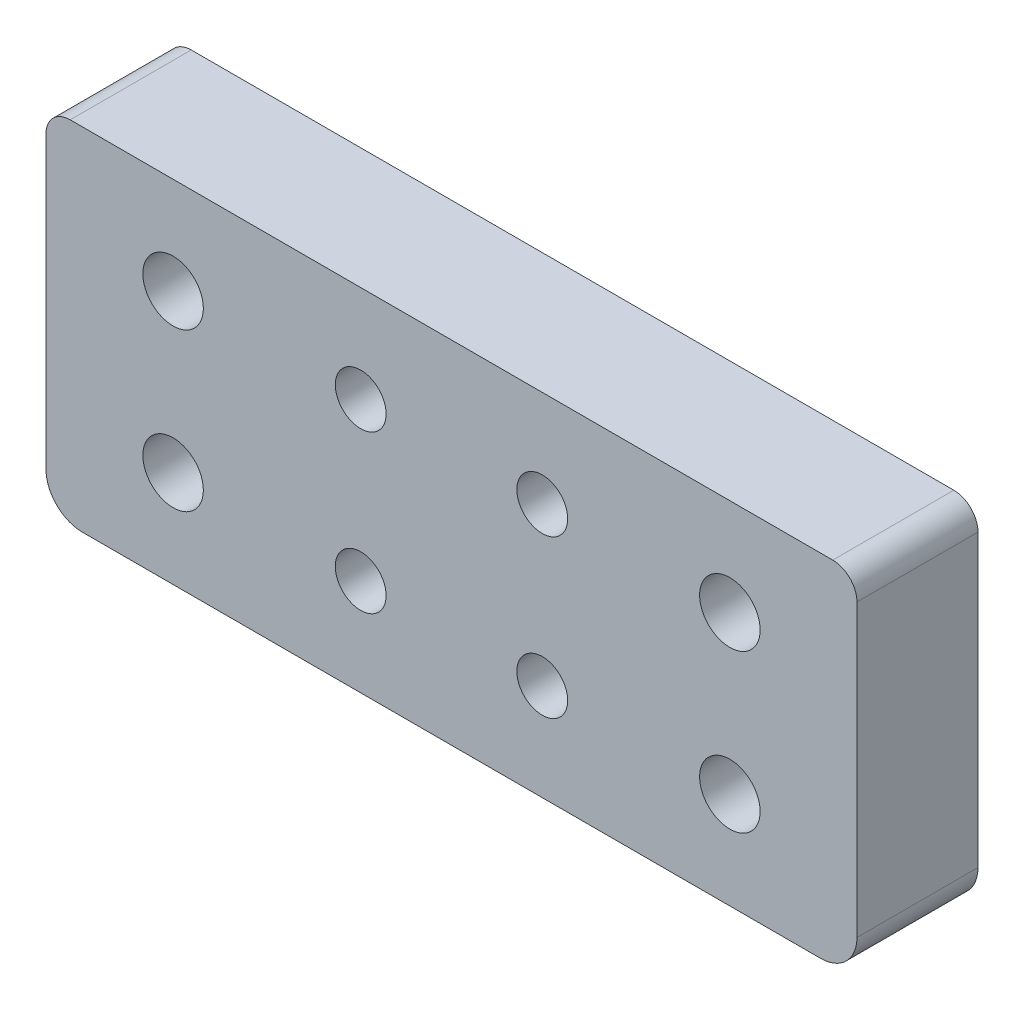
ISO-10303-21;
HEADER;
FILE_DESCRIPTION(('STEP AP214'),'2;1');
FILE_NAME('part.step','',(''),(''),'','','');
FILE_SCHEMA(('AUTOMOTIVE_DESIGN { 1 0 10303 214 1 1 1 1 }'));
ENDSEC;
DATA;
#1=APPLICATION_CONTEXT('core data for automotive mechanical design processes');
#2=APPLICATION_PROTOCOL_DEFINITION('international standard','automotive_design',2000,#1);
#3=PRODUCT_CONTEXT('',#1,'mechanical');
#4=PRODUCT('Part','Part','',(#3));
#5=PRODUCT_RELATED_PRODUCT_CATEGORY('part','',(#4));
#6=PRODUCT_DEFINITION_FORMATION('','',#4);
#7=PRODUCT_DEFINITION_CONTEXT('part definition',#1,'design');
#8=PRODUCT_DEFINITION('design','',#6,#7);
#9=PRODUCT_DEFINITION_SHAPE('','',#8);
#10=(LENGTH_UNIT() NAMED_UNIT(*) SI_UNIT(.MILLI.,.METRE.));
#11=(NAMED_UNIT(*) PLANE_ANGLE_UNIT() SI_UNIT($,.RADIAN.));
#12=(NAMED_UNIT(*) SI_UNIT($,.STERADIAN.) SOLID_ANGLE_UNIT());
#13=UNCERTAINTY_MEASURE_WITH_UNIT(LENGTH_MEASURE(1.E-05),#10,'distance_accuracy_value','');
#14=(GEOMETRIC_REPRESENTATION_CONTEXT(3) GLOBAL_UNCERTAINTY_ASSIGNED_CONTEXT((#13)) GLOBAL_UNIT_ASSIGNED_CONTEXT((#10,
#11,#12)) REPRESENTATION_CONTEXT('',''));
#15=CARTESIAN_POINT('',(0.,0.,0.));
#16=DIRECTION('',(0.,0.,1.));
#17=DIRECTION('',(1.,0.,0.));
#18=AXIS2_PLACEMENT_3D('',#15,#16,#17);
#19=CARTESIAN_POINT('',(0.,0.,10.));
#20=DIRECTION('',(0.,0.,-1.));
#21=DIRECTION('',(-1.,0.,0.));
#22=AXIS2_PLACEMENT_3D('',#19,#20,#21);
#23=PLANE('',#22);
#24=CARTESIAN_POINT('',(-23.,-13.,10.));
#25=DIRECTION('',(0.,0.,1.));
#26=DIRECTION('',(1.,0.,0.));
#27=AXIS2_PLACEMENT_3D('',#24,#25,#26);
#28=CIRCLE('',#27,2.5);
#29=CARTESIAN_POINT('',(-20.5,-13.,10.));
#30=VERTEX_POINT('',#29);
#31=EDGE_CURVE('E297',#30,#30,#28,.T.);
#32=ORIENTED_EDGE('',*,*,#31,.F.);
#33=EDGE_LOOP('',(#32));
#34=FACE_BOUND('',#33,.T.);
#35=CARTESIAN_POINT('',(-7.5,-13.,10.));
#36=DIRECTION('',(0.,0.,1.));
#37=DIRECTION('',(1.,0.,0.));
#38=AXIS2_PLACEMENT_3D('',#35,#36,#37);
#39=CIRCLE('',#38,2.1);
#40=CARTESIAN_POINT('',(-5.4,-13.,10.));
#41=VERTEX_POINT('',#40);
#42=EDGE_CURVE('E152',#41,#41,#39,.T.);
#43=ORIENTED_EDGE('',*,*,#42,.F.);
#44=EDGE_LOOP('',(#43));
#45=FACE_BOUND('',#44,.T.);
#46=DIRECTION('',(-1.,0.,0.));
#47=VECTOR('',#46,1.);
#48=CARTESIAN_POINT('',(-33.5,-21.,10.));
#49=LINE('',#48,#47);
#50=CARTESIAN_POINT('',(30.5,-21.,10.));
#51=VERTEX_POINT('',#50);
#52=CARTESIAN_POINT('',(-30.5,-21.,10.));
#53=VERTEX_POINT('',#52);
#54=EDGE_CURVE('E172',#51,#53,#49,.T.);
#55=ORIENTED_EDGE('',*,*,#54,.F.);
#56=CARTESIAN_POINT('',(30.5,-18.,10.));
#57=DIRECTION('',(0.,0.,-1.));
#58=DIRECTION('',(-1.,0.,0.));
#59=AXIS2_PLACEMENT_3D('',#56,#57,#58);
#60=CIRCLE('',#59,3.);
#61=CARTESIAN_POINT('',(33.5,-18.,10.));
#62=VERTEX_POINT('',#61);
#63=EDGE_CURVE('E161',#51,#62,#60,.F.);
#64=ORIENTED_EDGE('',*,*,#63,.T.);
#65=DIRECTION('',(0.,1.,0.));
#66=VECTOR('',#65,1.);
#67=CARTESIAN_POINT('',(33.5,-8.,10.));
#68=LINE('',#67,#66);
#69=CARTESIAN_POINT('',(33.5,6.,10.));
#70=VERTEX_POINT('',#69);
#71=EDGE_CURVE('E177',#62,#70,#68,.T.);
#72=ORIENTED_EDGE('',*,*,#71,.T.);
#73=CARTESIAN_POINT('',(31.5,6.,10.));
#74=DIRECTION('',(0.,0.,-1.));
#75=DIRECTION('',(-1.,0.,0.));
#76=AXIS2_PLACEMENT_3D('',#73,#74,#75);
#77=CIRCLE('',#76,2.);
#78=CARTESIAN_POINT('',(31.5,8.,10.));
#79=VERTEX_POINT('',#78);
#80=EDGE_CURVE('E133',#70,#79,#77,.F.);
#81=ORIENTED_EDGE('',*,*,#80,.T.);
#82=DIRECTION('',(-1.,0.,0.));
#83=VECTOR('',#82,1.);
#84=CARTESIAN_POINT('',(-33.5,8.,10.));
#85=LINE('',#84,#83);
#86=CARTESIAN_POINT('',(-31.5,8.,10.));
#87=VERTEX_POINT('',#86);
#88=EDGE_CURVE('E178',#79,#87,#85,.T.);
#89=ORIENTED_EDGE('',*,*,#88,.T.);
#90=CARTESIAN_POINT('',(-31.5,6.,10.));
#91=DIRECTION('',(0.,0.,-1.));
#92=DIRECTION('',(-1.,0.,0.));
#93=AXIS2_PLACEMENT_3D('',#90,#91,#92);
#94=CIRCLE('',#93,2.);
#95=CARTESIAN_POINT('',(-33.5,6.,10.));
#96=VERTEX_POINT('',#95);
#97=EDGE_CURVE('E200',#87,#96,#94,.F.);
#98=ORIENTED_EDGE('',*,*,#97,.T.);
#99=DIRECTION('',(0.,-1.,0.));
#100=VECTOR('',#99,1.);
#101=CARTESIAN_POINT('',(-33.5,-8.,10.));
#102=LINE('',#101,#100);
#103=CARTESIAN_POINT('',(-33.5,-18.,10.));
#104=VERTEX_POINT('',#103);
#105=EDGE_CURVE('E130',#96,#104,#102,.T.);
#106=ORIENTED_EDGE('',*,*,#105,.T.);
#107=CARTESIAN_POINT('',(-30.5,-18.,10.));
#108=DIRECTION('',(0.,0.,-1.));
#109=DIRECTION('',(-1.,0.,0.));
#110=AXIS2_PLACEMENT_3D('',#107,#108,#109);
#111=CIRCLE('',#110,3.);
#112=EDGE_CURVE('E159',#104,#53,#111,.F.);
#113=ORIENTED_EDGE('',*,*,#112,.T.);
#114=EDGE_LOOP('',(#55,#64,#72,#81,#89,#98,#106,#113));
#115=FACE_BOUND('',#114,.T.);
#116=CARTESIAN_POINT('',(-23.,0.,10.));
#117=DIRECTION('',(0.,0.,1.));
#118=DIRECTION('',(1.,0.,0.));
#119=AXIS2_PLACEMENT_3D('',#116,#117,#118);
#120=CIRCLE('',#119,2.5);
#121=CARTESIAN_POINT('',(-20.5,0.,10.));
#122=VERTEX_POINT('',#121);
#123=EDGE_CURVE('E305',#122,#122,#120,.T.);
#124=ORIENTED_EDGE('',*,*,#123,.F.);
#125=EDGE_LOOP('',(#124));
#126=FACE_BOUND('',#125,.T.);
#127=CARTESIAN_POINT('',(23.,0.,10.));
#128=DIRECTION('',(0.,0.,1.));
#129=DIRECTION('',(1.,0.,0.));
#130=AXIS2_PLACEMENT_3D('',#127,#128,#129);
#131=CIRCLE('',#130,2.5);
#132=CARTESIAN_POINT('',(25.5,0.,10.));
#133=VERTEX_POINT('',#132);
#134=EDGE_CURVE('E193',#133,#133,#131,.T.);
#135=ORIENTED_EDGE('',*,*,#134,.F.);
#136=EDGE_LOOP('',(#135));
#137=FACE_BOUND('',#136,.T.);
#138=CARTESIAN_POINT('',(-7.5,0.,10.));
#139=DIRECTION('',(0.,0.,1.));
#140=DIRECTION('',(1.,0.,0.));
#141=AXIS2_PLACEMENT_3D('',#138,#139,#140);
#142=CIRCLE('',#141,2.1);
#143=CARTESIAN_POINT('',(-5.4,0.,10.));
#144=VERTEX_POINT('',#143);
#145=EDGE_CURVE('E192',#144,#144,#142,.T.);
#146=ORIENTED_EDGE('',*,*,#145,.F.);
#147=EDGE_LOOP('',(#146));
#148=FACE_BOUND('',#147,.T.);
#149=CARTESIAN_POINT('',(7.5,0.,10.));
#150=DIRECTION('',(0.,0.,1.));
#151=DIRECTION('',(1.,0.,0.));
#152=AXIS2_PLACEMENT_3D('',#149,#150,#151);
#153=CIRCLE('',#152,2.1);
#154=CARTESIAN_POINT('',(9.6,0.,10.));
#155=VERTEX_POINT('',#154);
#156=EDGE_CURVE('E276',#155,#155,#153,.T.);
#157=ORIENTED_EDGE('',*,*,#156,.F.);
#158=EDGE_LOOP('',(#157));
#159=FACE_BOUND('',#158,.T.);
#160=CARTESIAN_POINT('',(7.5,-13.,10.));
#161=DIRECTION('',(0.,0.,1.));
#162=DIRECTION('',(1.,0.,0.));
#163=AXIS2_PLACEMENT_3D('',#160,#161,#162);
#164=CIRCLE('',#163,2.1);
#165=CARTESIAN_POINT('',(9.6,-13.,10.));
#166=VERTEX_POINT('',#165);
#167=EDGE_CURVE('E148',#166,#166,#164,.T.);
#168=ORIENTED_EDGE('',*,*,#167,.F.);
#169=EDGE_LOOP('',(#168));
#170=FACE_BOUND('',#169,.T.);
#171=CARTESIAN_POINT('',(23.,-13.,10.));
#172=DIRECTION('',(0.,0.,1.));
#173=DIRECTION('',(1.,0.,0.));
#174=AXIS2_PLACEMENT_3D('',#171,#172,#173);
#175=CIRCLE('',#174,2.5);
#176=CARTESIAN_POINT('',(25.5,-13.,10.));
#177=VERTEX_POINT('',#176);
#178=EDGE_CURVE('E155',#177,#177,#175,.T.);
#179=ORIENTED_EDGE('',*,*,#178,.F.);
#180=EDGE_LOOP('',(#179));
#181=FACE_BOUND('',#180,.T.);
#182=ADVANCED_FACE('F47',(#34,#45,#115,#126,#137,#148,#159,#170,#181),#23,.F.);
#183=CARTESIAN_POINT('',(-33.5,8.,10.));
#184=DIRECTION('',(0.,-1.,0.));
#185=DIRECTION('',(0.,0.,-1.));
#186=AXIS2_PLACEMENT_3D('',#183,#184,#185);
#187=PLANE('',#186);
#188=DIRECTION('',(-1.,0.,0.));
#189=VECTOR('',#188,1.);
#190=CARTESIAN_POINT('',(-33.5,8.,0.));
#191=LINE('',#190,#189);
#192=CARTESIAN_POINT('',(31.5,8.,0.));
#193=VERTEX_POINT('',#192);
#194=CARTESIAN_POINT('',(-31.5,8.,0.));
#195=VERTEX_POINT('',#194);
#196=EDGE_CURVE('E118',#193,#195,#191,.T.);
#197=ORIENTED_EDGE('',*,*,#196,.T.);
#198=DIRECTION('',(0.,0.,-1.));
#199=VECTOR('',#198,1.);
#200=CARTESIAN_POINT('',(-31.5,8.,10.));
#201=LINE('',#200,#199);
#202=EDGE_CURVE('E135',#195,#87,#201,.F.);
#203=ORIENTED_EDGE('',*,*,#202,.T.);
#204=ORIENTED_EDGE('',*,*,#88,.F.);
#205=DIRECTION('',(0.,0.,-1.));
#206=VECTOR('',#205,1.);
#207=CARTESIAN_POINT('',(31.5,8.,10.));
#208=LINE('',#207,#206);
#209=EDGE_CURVE('E140',#79,#193,#208,.T.);
#210=ORIENTED_EDGE('',*,*,#209,.T.);
#211=EDGE_LOOP('',(#197,#203,#204,#210));
#212=FACE_BOUND('',#211,.T.);
#213=ADVANCED_FACE('F203',(#212),#187,.F.);
#214=CARTESIAN_POINT('',(-33.5,-8.,10.));
#215=DIRECTION('',(1.,0.,0.));
#216=DIRECTION('',(0.,0.,-1.));
#217=AXIS2_PLACEMENT_3D('',#214,#215,#216);
#218=PLANE('',#217);
#219=DIRECTION('',(0.,-1.,0.));
#220=VECTOR('',#219,1.);
#221=CARTESIAN_POINT('',(-33.5,-8.,0.));
#222=LINE('',#221,#220);
#223=CARTESIAN_POINT('',(-33.5,6.,0.));
#224=VERTEX_POINT('',#223);
#225=CARTESIAN_POINT('',(-33.5,-18.,0.));
#226=VERTEX_POINT('',#225);
#227=EDGE_CURVE('E179',#224,#226,#222,.T.);
#228=ORIENTED_EDGE('',*,*,#227,.T.);
#229=DIRECTION('',(0.,0.,-1.));
#230=VECTOR('',#229,1.);
#231=CARTESIAN_POINT('',(-33.5,-18.,10.));
#232=LINE('',#231,#230);
#233=EDGE_CURVE('E11',#226,#104,#232,.F.);
#234=ORIENTED_EDGE('',*,*,#233,.T.);
#235=ORIENTED_EDGE('',*,*,#105,.F.);
#236=DIRECTION('',(0.,0.,-1.));
#237=VECTOR('',#236,1.);
#238=CARTESIAN_POINT('',(-33.5,6.,10.));
#239=LINE('',#238,#237);
#240=EDGE_CURVE('E196',#96,#224,#239,.T.);
#241=ORIENTED_EDGE('',*,*,#240,.T.);
#242=EDGE_LOOP('',(#228,#234,#235,#241));
#243=FACE_BOUND('',#242,.T.);
#244=ADVANCED_FACE('F211',(#243),#218,.F.);
#245=CARTESIAN_POINT('',(0.,0.,0.));
#246=DIRECTION('',(0.,0.,-1.));
#247=DIRECTION('',(-1.,0.,0.));
#248=AXIS2_PLACEMENT_3D('',#245,#246,#247);
#249=PLANE('',#248);
#250=CARTESIAN_POINT('',(-23.,-13.,0.));
#251=DIRECTION('',(0.,0.,-1.));
#252=DIRECTION('',(-1.,0.,0.));
#253=AXIS2_PLACEMENT_3D('',#250,#251,#252);
#254=CIRCLE('',#253,2.5);
#255=CARTESIAN_POINT('',(-25.5,-13.,0.));
#256=VERTEX_POINT('',#255);
#257=EDGE_CURVE('E294',#256,#256,#254,.T.);
#258=ORIENTED_EDGE('',*,*,#257,.F.);
#259=EDGE_LOOP('',(#258));
#260=FACE_BOUND('',#259,.T.);
#261=CARTESIAN_POINT('',(23.,-13.,0.));
#262=DIRECTION('',(0.,0.,-1.));
#263=DIRECTION('',(-1.,0.,0.));
#264=AXIS2_PLACEMENT_3D('',#261,#262,#263);
#265=CIRCLE('',#264,2.5);
#266=CARTESIAN_POINT('',(20.5,-13.,0.));
#267=VERTEX_POINT('',#266);
#268=EDGE_CURVE('E153',#267,#267,#265,.T.);
#269=ORIENTED_EDGE('',*,*,#268,.F.);
#270=EDGE_LOOP('',(#269));
#271=FACE_BOUND('',#270,.T.);
#272=CARTESIAN_POINT('',(-7.5,-13.,0.));
#273=DIRECTION('',(0.,0.,-1.));
#274=DIRECTION('',(-1.,0.,0.));
#275=AXIS2_PLACEMENT_3D('',#272,#273,#274);
#276=CIRCLE('',#275,2.1);
#277=CARTESIAN_POINT('',(-9.6,-13.,0.));
#278=VERTEX_POINT('',#277);
#279=EDGE_CURVE('E149',#278,#278,#276,.T.);
#280=ORIENTED_EDGE('',*,*,#279,.F.);
#281=EDGE_LOOP('',(#280));
#282=FACE_BOUND('',#281,.T.);
#283=CARTESIAN_POINT('',(7.5,-13.,0.));
#284=DIRECTION('',(0.,0.,-1.));
#285=DIRECTION('',(-1.,0.,0.));
#286=AXIS2_PLACEMENT_3D('',#283,#284,#285);
#287=CIRCLE('',#286,2.1);
#288=CARTESIAN_POINT('',(5.4,-13.,0.));
#289=VERTEX_POINT('',#288);
#290=EDGE_CURVE('E144',#289,#289,#287,.T.);
#291=ORIENTED_EDGE('',*,*,#290,.F.);
#292=EDGE_LOOP('',(#291));
#293=FACE_BOUND('',#292,.T.);
#294=DIRECTION('',(0.,1.,0.));
#295=VECTOR('',#294,1.);
#296=CARTESIAN_POINT('',(33.5,-8.,0.));
#297=LINE('',#296,#295);
#298=CARTESIAN_POINT('',(33.5,-18.,0.));
#299=VERTEX_POINT('',#298);
#300=CARTESIAN_POINT('',(33.5,6.,0.));
#301=VERTEX_POINT('',#300);
#302=EDGE_CURVE('E111',#299,#301,#297,.T.);
#303=ORIENTED_EDGE('',*,*,#302,.F.);
#304=CARTESIAN_POINT('',(30.5,-18.,0.));
#305=DIRECTION('',(0.,0.,-1.));
#306=DIRECTION('',(-1.,0.,0.));
#307=AXIS2_PLACEMENT_3D('',#304,#305,#306);
#308=CIRCLE('',#307,3.);
#309=CARTESIAN_POINT('',(30.5,-21.,0.));
#310=VERTEX_POINT('',#309);
#311=EDGE_CURVE('E55',#299,#310,#308,.T.);
#312=ORIENTED_EDGE('',*,*,#311,.T.);
#313=DIRECTION('',(1.,0.,0.));
#314=VECTOR('',#313,1.);
#315=CARTESIAN_POINT('',(-33.5,-21.,0.));
#316=LINE('',#315,#314);
#317=CARTESIAN_POINT('',(-30.5,-21.,0.));
#318=VERTEX_POINT('',#317);
#319=EDGE_CURVE('E147',#318,#310,#316,.T.);
#320=ORIENTED_EDGE('',*,*,#319,.F.);
#321=CARTESIAN_POINT('',(-30.5,-18.,0.));
#322=DIRECTION('',(0.,0.,-1.));
#323=DIRECTION('',(-1.,0.,0.));
#324=AXIS2_PLACEMENT_3D('',#321,#322,#323);
#325=CIRCLE('',#324,3.);
#326=EDGE_CURVE('E62',#318,#226,#325,.T.);
#327=ORIENTED_EDGE('',*,*,#326,.T.);
#328=ORIENTED_EDGE('',*,*,#227,.F.);
#329=CARTESIAN_POINT('',(-31.5,6.,0.));
#330=DIRECTION('',(0.,0.,-1.));
#331=DIRECTION('',(-1.,0.,0.));
#332=AXIS2_PLACEMENT_3D('',#329,#330,#331);
#333=CIRCLE('',#332,2.);
#334=EDGE_CURVE('E129',#224,#195,#333,.T.);
#335=ORIENTED_EDGE('',*,*,#334,.T.);
#336=ORIENTED_EDGE('',*,*,#196,.F.);
#337=CARTESIAN_POINT('',(31.5,6.,0.));
#338=DIRECTION('',(0.,0.,-1.));
#339=DIRECTION('',(-1.,0.,0.));
#340=AXIS2_PLACEMENT_3D('',#337,#338,#339);
#341=CIRCLE('',#340,2.);
#342=EDGE_CURVE('E122',#193,#301,#341,.T.);
#343=ORIENTED_EDGE('',*,*,#342,.T.);
#344=EDGE_LOOP('',(#303,#312,#320,#327,#328,#335,#336,#343));
#345=FACE_BOUND('',#344,.T.);
#346=CARTESIAN_POINT('',(-23.,0.,0.));
#347=DIRECTION('',(0.,0.,-1.));
#348=DIRECTION('',(-1.,0.,0.));
#349=AXIS2_PLACEMENT_3D('',#346,#347,#348);
#350=CIRCLE('',#349,2.5);
#351=CARTESIAN_POINT('',(-25.5,0.,0.));
#352=VERTEX_POINT('',#351);
#353=EDGE_CURVE('E307',#352,#352,#350,.T.);
#354=ORIENTED_EDGE('',*,*,#353,.F.);
#355=EDGE_LOOP('',(#354));
#356=FACE_BOUND('',#355,.T.);
#357=CARTESIAN_POINT('',(23.,0.,0.));
#358=DIRECTION('',(0.,0.,-1.));
#359=DIRECTION('',(-1.,0.,0.));
#360=AXIS2_PLACEMENT_3D('',#357,#358,#359);
#361=CIRCLE('',#360,2.5);
#362=CARTESIAN_POINT('',(20.5,0.,0.));
#363=VERTEX_POINT('',#362);
#364=EDGE_CURVE('E190',#363,#363,#361,.T.);
#365=ORIENTED_EDGE('',*,*,#364,.F.);
#366=EDGE_LOOP('',(#365));
#367=FACE_BOUND('',#366,.T.);
#368=CARTESIAN_POINT('',(-7.5,0.,0.));
#369=DIRECTION('',(0.,0.,-1.));
#370=DIRECTION('',(-1.,0.,0.));
#371=AXIS2_PLACEMENT_3D('',#368,#369,#370);
#372=CIRCLE('',#371,2.1);
#373=CARTESIAN_POINT('',(-9.6,0.,0.));
#374=VERTEX_POINT('',#373);
#375=EDGE_CURVE('E271',#374,#374,#372,.T.);
#376=ORIENTED_EDGE('',*,*,#375,.F.);
#377=EDGE_LOOP('',(#376));
#378=FACE_BOUND('',#377,.T.);
#379=CARTESIAN_POINT('',(7.5,0.,0.));
#380=DIRECTION('',(0.,0.,-1.));
#381=DIRECTION('',(-1.,0.,0.));
#382=AXIS2_PLACEMENT_3D('',#379,#380,#381);
#383=CIRCLE('',#382,2.1);
#384=CARTESIAN_POINT('',(5.4,0.,0.));
#385=VERTEX_POINT('',#384);
#386=EDGE_CURVE('E119',#385,#385,#383,.T.);
#387=ORIENTED_EDGE('',*,*,#386,.F.);
#388=EDGE_LOOP('',(#387));
#389=FACE_BOUND('',#388,.T.);
#390=ADVANCED_FACE('F123',(#260,#271,#282,#293,#345,#356,#367,#378,#389),#249,.T.);
#391=CARTESIAN_POINT('',(7.5,0.,10.));
#392=DIRECTION('',(0.,0.,1.));
#393=DIRECTION('',(1.,0.,0.));
#394=AXIS2_PLACEMENT_3D('',#391,#392,#393);
#395=CYLINDRICAL_SURFACE('',#394,2.1);
#396=ORIENTED_EDGE('',*,*,#386,.T.);
#397=EDGE_LOOP('',(#396));
#398=FACE_BOUND('',#397,.T.);
#399=ORIENTED_EDGE('',*,*,#156,.T.);
#400=EDGE_LOOP('',(#399));
#401=FACE_BOUND('',#400,.T.);
#402=ADVANCED_FACE('F233',(#398,#401),#395,.F.);
#403=CARTESIAN_POINT('',(-7.5,0.,10.));
#404=DIRECTION('',(0.,0.,1.));
#405=DIRECTION('',(1.,0.,0.));
#406=AXIS2_PLACEMENT_3D('',#403,#404,#405);
#407=CYLINDRICAL_SURFACE('',#406,2.1);
#408=ORIENTED_EDGE('',*,*,#375,.T.);
#409=EDGE_LOOP('',(#408));
#410=FACE_BOUND('',#409,.T.);
#411=ORIENTED_EDGE('',*,*,#145,.T.);
#412=EDGE_LOOP('',(#411));
#413=FACE_BOUND('',#412,.T.);
#414=ADVANCED_FACE('F260',(#410,#413),#407,.F.);
#415=CARTESIAN_POINT('',(23.,0.,10.));
#416=DIRECTION('',(0.,0.,1.));
#417=DIRECTION('',(1.,0.,0.));
#418=AXIS2_PLACEMENT_3D('',#415,#416,#417);
#419=CYLINDRICAL_SURFACE('',#418,2.5);
#420=ORIENTED_EDGE('',*,*,#364,.T.);
#421=EDGE_LOOP('',(#420));
#422=FACE_BOUND('',#421,.T.);
#423=ORIENTED_EDGE('',*,*,#134,.T.);
#424=EDGE_LOOP('',(#423));
#425=FACE_BOUND('',#424,.T.);
#426=ADVANCED_FACE('F257',(#422,#425),#419,.F.);
#427=CARTESIAN_POINT('',(-23.,0.,10.));
#428=DIRECTION('',(0.,0.,1.));
#429=DIRECTION('',(1.,0.,0.));
#430=AXIS2_PLACEMENT_3D('',#427,#428,#429);
#431=CYLINDRICAL_SURFACE('',#430,2.5);
#432=ORIENTED_EDGE('',*,*,#353,.T.);
#433=EDGE_LOOP('',(#432));
#434=FACE_BOUND('',#433,.T.);
#435=ORIENTED_EDGE('',*,*,#123,.T.);
#436=EDGE_LOOP('',(#435));
#437=FACE_BOUND('',#436,.T.);
#438=ADVANCED_FACE('F241',(#434,#437),#431,.F.);
#439=CARTESIAN_POINT('',(-31.5,6.,10.));
#440=DIRECTION('',(0.,0.,-1.));
#441=DIRECTION('',(-1.,0.,0.));
#442=AXIS2_PLACEMENT_3D('',#439,#440,#441);
#443=CYLINDRICAL_SURFACE('',#442,2.);
#444=ORIENTED_EDGE('',*,*,#97,.F.);
#445=ORIENTED_EDGE('',*,*,#202,.F.);
#446=ORIENTED_EDGE('',*,*,#334,.F.);
#447=ORIENTED_EDGE('',*,*,#240,.F.);
#448=EDGE_LOOP('',(#444,#445,#446,#447));
#449=FACE_BOUND('',#448,.T.);
#450=ADVANCED_FACE('F209',(#449),#443,.T.);
#451=CARTESIAN_POINT('',(31.5,6.,10.));
#452=DIRECTION('',(0.,0.,-1.));
#453=DIRECTION('',(-1.,0.,0.));
#454=AXIS2_PLACEMENT_3D('',#451,#452,#453);
#455=CYLINDRICAL_SURFACE('',#454,2.);
#456=ORIENTED_EDGE('',*,*,#80,.F.);
#457=DIRECTION('',(0.,0.,-1.));
#458=VECTOR('',#457,1.);
#459=CARTESIAN_POINT('',(33.5,6.,10.));
#460=LINE('',#459,#458);
#461=EDGE_CURVE('E115',#301,#70,#460,.F.);
#462=ORIENTED_EDGE('',*,*,#461,.F.);
#463=ORIENTED_EDGE('',*,*,#342,.F.);
#464=ORIENTED_EDGE('',*,*,#209,.F.);
#465=EDGE_LOOP('',(#456,#462,#463,#464));
#466=FACE_BOUND('',#465,.T.);
#467=ADVANCED_FACE('F132',(#466),#455,.T.);
#468=CARTESIAN_POINT('',(33.5,-21.,10.));
#469=DIRECTION('',(-1.,0.,0.));
#470=DIRECTION('',(0.,0.,1.));
#471=AXIS2_PLACEMENT_3D('',#468,#469,#470);
#472=PLANE('',#471);
#473=ORIENTED_EDGE('',*,*,#71,.F.);
#474=DIRECTION('',(0.,0.,1.));
#475=VECTOR('',#474,1.);
#476=CARTESIAN_POINT('',(33.5,-18.,0.));
#477=LINE('',#476,#475);
#478=EDGE_CURVE('E70',#62,#299,#477,.F.);
#479=ORIENTED_EDGE('',*,*,#478,.T.);
#480=ORIENTED_EDGE('',*,*,#302,.T.);
#481=ORIENTED_EDGE('',*,*,#461,.T.);
#482=EDGE_LOOP('',(#473,#479,#480,#481));
#483=FACE_BOUND('',#482,.T.);
#484=ADVANCED_FACE('F113',(#483),#472,.F.);
#485=CARTESIAN_POINT('',(0.,-21.,0.));
#486=DIRECTION('',(0.,-1.,0.));
#487=DIRECTION('',(0.,0.,-1.));
#488=AXIS2_PLACEMENT_3D('',#485,#486,#487);
#489=PLANE('',#488);
#490=ORIENTED_EDGE('',*,*,#319,.T.);
#491=DIRECTION('',(0.,0.,1.));
#492=VECTOR('',#491,1.);
#493=CARTESIAN_POINT('',(30.5,-21.,10.));
#494=LINE('',#493,#492);
#495=EDGE_CURVE('E138',#310,#51,#494,.T.);
#496=ORIENTED_EDGE('',*,*,#495,.T.);
#497=ORIENTED_EDGE('',*,*,#54,.T.);
#498=DIRECTION('',(0.,0.,-1.));
#499=VECTOR('',#498,1.);
#500=CARTESIAN_POINT('',(-30.5,-21.,0.));
#501=LINE('',#500,#499);
#502=EDGE_CURVE('E134',#53,#318,#501,.T.);
#503=ORIENTED_EDGE('',*,*,#502,.T.);
#504=EDGE_LOOP('',(#490,#496,#497,#503));
#505=FACE_BOUND('',#504,.T.);
#506=ADVANCED_FACE('F168',(#505),#489,.T.);
#507=CARTESIAN_POINT('',(7.5,-13.,10.));
#508=DIRECTION('',(0.,0.,1.));
#509=DIRECTION('',(1.,0.,0.));
#510=AXIS2_PLACEMENT_3D('',#507,#508,#509);
#511=CYLINDRICAL_SURFACE('',#510,2.1);
#512=ORIENTED_EDGE('',*,*,#290,.T.);
#513=EDGE_LOOP('',(#512));
#514=FACE_BOUND('',#513,.T.);
#515=ORIENTED_EDGE('',*,*,#167,.T.);
#516=EDGE_LOOP('',(#515));
#517=FACE_BOUND('',#516,.T.);
#518=ADVANCED_FACE('F251',(#514,#517),#511,.F.);
#519=CARTESIAN_POINT('',(-7.5,-13.,10.));
#520=DIRECTION('',(0.,0.,1.));
#521=DIRECTION('',(1.,0.,0.));
#522=AXIS2_PLACEMENT_3D('',#519,#520,#521);
#523=CYLINDRICAL_SURFACE('',#522,2.1);
#524=ORIENTED_EDGE('',*,*,#279,.T.);
#525=EDGE_LOOP('',(#524));
#526=FACE_BOUND('',#525,.T.);
#527=ORIENTED_EDGE('',*,*,#42,.T.);
#528=EDGE_LOOP('',(#527));
#529=FACE_BOUND('',#528,.T.);
#530=ADVANCED_FACE('F321',(#526,#529),#523,.F.);
#531=CARTESIAN_POINT('',(23.,-13.,10.));
#532=DIRECTION('',(0.,0.,1.));
#533=DIRECTION('',(1.,0.,0.));
#534=AXIS2_PLACEMENT_3D('',#531,#532,#533);
#535=CYLINDRICAL_SURFACE('',#534,2.5);
#536=ORIENTED_EDGE('',*,*,#268,.T.);
#537=EDGE_LOOP('',(#536));
#538=FACE_BOUND('',#537,.T.);
#539=ORIENTED_EDGE('',*,*,#178,.T.);
#540=EDGE_LOOP('',(#539));
#541=FACE_BOUND('',#540,.T.);
#542=ADVANCED_FACE('F326',(#538,#541),#535,.F.);
#543=CARTESIAN_POINT('',(-23.,-13.,10.));
#544=DIRECTION('',(0.,0.,1.));
#545=DIRECTION('',(1.,0.,0.));
#546=AXIS2_PLACEMENT_3D('',#543,#544,#545);
#547=CYLINDRICAL_SURFACE('',#546,2.5);
#548=ORIENTED_EDGE('',*,*,#257,.T.);
#549=EDGE_LOOP('',(#548));
#550=FACE_BOUND('',#549,.T.);
#551=ORIENTED_EDGE('',*,*,#31,.T.);
#552=EDGE_LOOP('',(#551));
#553=FACE_BOUND('',#552,.T.);
#554=ADVANCED_FACE('F219',(#550,#553),#547,.F.);
#555=CARTESIAN_POINT('',(30.5,-18.,0.));
#556=DIRECTION('',(0.,0.,-1.));
#557=DIRECTION('',(-1.,0.,0.));
#558=AXIS2_PLACEMENT_3D('',#555,#556,#557);
#559=CYLINDRICAL_SURFACE('',#558,3.);
#560=ORIENTED_EDGE('',*,*,#311,.F.);
#561=ORIENTED_EDGE('',*,*,#478,.F.);
#562=ORIENTED_EDGE('',*,*,#63,.F.);
#563=ORIENTED_EDGE('',*,*,#495,.F.);
#564=EDGE_LOOP('',(#560,#561,#562,#563));
#565=FACE_BOUND('',#564,.T.);
#566=ADVANCED_FACE('F174',(#565),#559,.T.);
#567=CARTESIAN_POINT('',(-30.5,-18.,0.));
#568=DIRECTION('',(0.,0.,1.));
#569=DIRECTION('',(1.,0.,0.));
#570=AXIS2_PLACEMENT_3D('',#567,#568,#569);
#571=CYLINDRICAL_SURFACE('',#570,3.);
#572=ORIENTED_EDGE('',*,*,#112,.F.);
#573=ORIENTED_EDGE('',*,*,#233,.F.);
#574=ORIENTED_EDGE('',*,*,#326,.F.);
#575=ORIENTED_EDGE('',*,*,#502,.F.);
#576=EDGE_LOOP('',(#572,#573,#574,#575));
#577=FACE_BOUND('',#576,.T.);
#578=ADVANCED_FACE('F49',(#577),#571,.T.);
#579=CLOSED_SHELL('',(#182,#213,#244,#390,#402,#414,#426,#438,#450,#467,#484,#506,#518,#530,
#542,#554,#566,#578));
#580=MANIFOLD_SOLID_BREP('B2',#579);
#581=ADVANCED_BREP_SHAPE_REPRESENTATION('',(#18,#580),#14);
#582=SHAPE_DEFINITION_REPRESENTATION(#9,#581);
ENDSEC;
END-ISO-10303-21;
